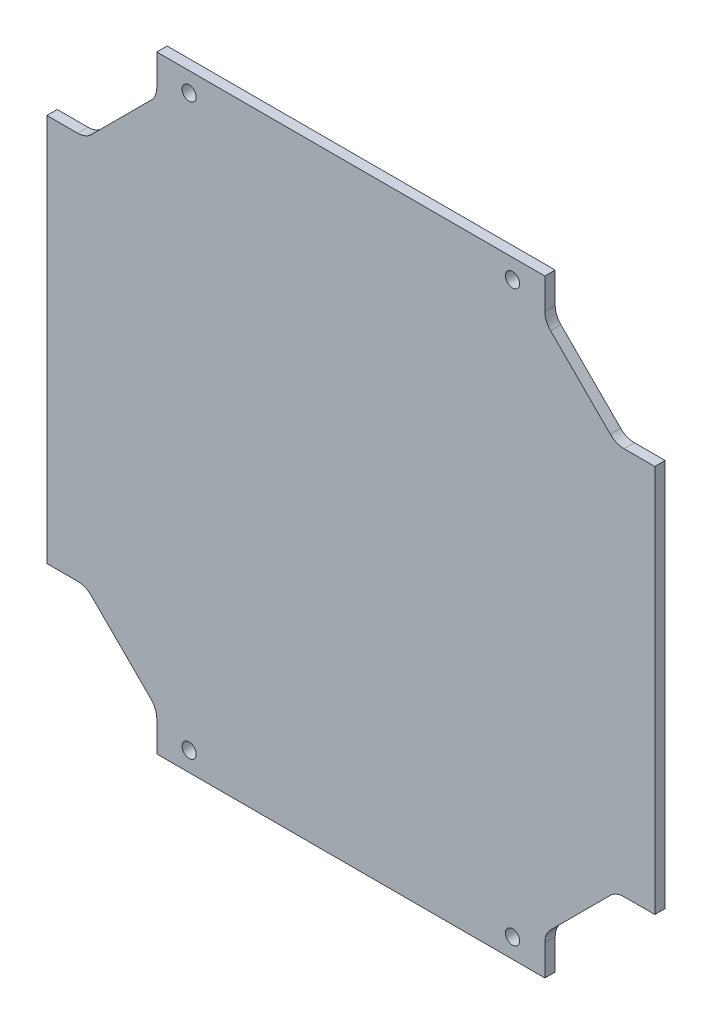
ISO-10303-21;
HEADER;
FILE_DESCRIPTION(('STEP AP214'),'2;1');
FILE_NAME('part.step','',(''),(''),'','','');
FILE_SCHEMA(('AUTOMOTIVE_DESIGN { 1 0 10303 214 1 1 1 1 }'));
ENDSEC;
DATA;
#1=APPLICATION_CONTEXT('core data for automotive mechanical design processes');
#2=APPLICATION_PROTOCOL_DEFINITION('international standard','automotive_design',2000,#1);
#3=PRODUCT_CONTEXT('',#1,'mechanical');
#4=PRODUCT('Part','Part','',(#3));
#5=PRODUCT_RELATED_PRODUCT_CATEGORY('part','',(#4));
#6=PRODUCT_DEFINITION_FORMATION('','',#4);
#7=PRODUCT_DEFINITION_CONTEXT('part definition',#1,'design');
#8=PRODUCT_DEFINITION('design','',#6,#7);
#9=PRODUCT_DEFINITION_SHAPE('','',#8);
#10=(LENGTH_UNIT() NAMED_UNIT(*) SI_UNIT(.MILLI.,.METRE.));
#11=(NAMED_UNIT(*) PLANE_ANGLE_UNIT() SI_UNIT($,.RADIAN.));
#12=(NAMED_UNIT(*) SI_UNIT($,.STERADIAN.) SOLID_ANGLE_UNIT());
#13=UNCERTAINTY_MEASURE_WITH_UNIT(LENGTH_MEASURE(1.E-05),#10,'distance_accuracy_value','');
#14=(GEOMETRIC_REPRESENTATION_CONTEXT(3) GLOBAL_UNCERTAINTY_ASSIGNED_CONTEXT((#13)) GLOBAL_UNIT_ASSIGNED_CONTEXT((#10,
#11,#12)) REPRESENTATION_CONTEXT('',''));
#15=CARTESIAN_POINT('',(0.,0.,0.));
#16=DIRECTION('',(0.,0.,1.));
#17=DIRECTION('',(1.,0.,0.));
#18=AXIS2_PLACEMENT_3D('',#15,#16,#17);
#19=CARTESIAN_POINT('',(-69.5653438799531,14.9518569300748,1.6));
#20=DIRECTION('',(0.,0.,-1.));
#21=DIRECTION('',(-1.,0.,0.));
#22=AXIS2_PLACEMENT_3D('',#19,#20,#21);
#23=PLANE('',#22);
#24=CARTESIAN_POINT('',(-14.5653438799531,88.9518569300749,1.6));
#25=DIRECTION('',(0.,0.,1.));
#26=DIRECTION('',(1.,0.,0.));
#27=AXIS2_PLACEMENT_3D('',#24,#25,#26);
#28=CIRCLE('',#27,1.1);
#29=CARTESIAN_POINT('',(-13.4653438799531,88.9518569300749,1.6));
#30=VERTEX_POINT('',#29);
#31=EDGE_CURVE('E730',#30,#30,#28,.T.);
#32=ORIENTED_EDGE('',*,*,#31,.F.);
#33=EDGE_LOOP('',(#32));
#34=FACE_BOUND('',#33,.T.);
#35=CARTESIAN_POINT('',(-64.5653438799532,88.9518569300749,1.6));
#36=DIRECTION('',(0.,0.,1.));
#37=DIRECTION('',(1.,0.,0.));
#38=AXIS2_PLACEMENT_3D('',#35,#36,#37);
#39=CIRCLE('',#38,1.10000000000001);
#40=CARTESIAN_POINT('',(-63.4653438799532,88.9518569300749,1.6));
#41=VERTEX_POINT('',#40);
#42=EDGE_CURVE('E257',#41,#41,#39,.T.);
#43=ORIENTED_EDGE('',*,*,#42,.F.);
#44=EDGE_LOOP('',(#43));
#45=FACE_BOUND('',#44,.T.);
#46=DIRECTION('',(1.,0.,0.));
#47=VECTOR('',#46,1.);
#48=CARTESIAN_POINT('',(-86.5653438799531,14.9518569300748,1.6));
#49=LINE('',#48,#47);
#50=CARTESIAN_POINT('',(-86.5653438799531,14.9518569300748,1.6));
#51=VERTEX_POINT('',#50);
#52=CARTESIAN_POINT('',(-81.8079845670724,14.9518569300748,1.6));
#53=VERTEX_POINT('',#52);
#54=EDGE_CURVE('E292',#51,#53,#49,.T.);
#55=ORIENTED_EDGE('',*,*,#54,.T.);
#56=CARTESIAN_POINT('',(-81.8079845670724,11.9518569300748,1.6));
#57=DIRECTION('',(0.,0.,-1.));
#58=DIRECTION('',(-1.,0.,0.));
#59=AXIS2_PLACEMENT_3D('',#56,#57,#58);
#60=CIRCLE('',#59,3.);
#61=CARTESIAN_POINT('',(-79.6866642235128,14.0731772736345,1.6));
#62=VERTEX_POINT('',#61);
#63=EDGE_CURVE('E350',#53,#62,#60,.T.);
#64=ORIENTED_EDGE('',*,*,#63,.T.);
#65=DIRECTION('',(0.707106781186547,-0.707106781186547,0.));
#66=VECTOR('',#65,1.);
#67=CARTESIAN_POINT('',(-80.5653438799531,14.9518569300748,1.6));
#68=LINE('',#67,#66);
#69=CARTESIAN_POINT('',(-70.4440235363935,4.83053658651517,1.6));
#70=VERTEX_POINT('',#69);
#71=EDGE_CURVE('E206',#62,#70,#68,.T.);
#72=ORIENTED_EDGE('',*,*,#71,.T.);
#73=CARTESIAN_POINT('',(-72.5653438799532,2.70921624295552,1.6));
#74=DIRECTION('',(0.,0.,-1.));
#75=DIRECTION('',(-1.,0.,0.));
#76=AXIS2_PLACEMENT_3D('',#73,#74,#75);
#77=CIRCLE('',#76,3.);
#78=CARTESIAN_POINT('',(-69.5653438799531,2.70921624295552,1.6));
#79=VERTEX_POINT('',#78);
#80=EDGE_CURVE('E202',#70,#79,#77,.T.);
#81=ORIENTED_EDGE('',*,*,#80,.T.);
#82=DIRECTION('',(0.,-1.,0.));
#83=VECTOR('',#82,1.);
#84=CARTESIAN_POINT('',(-69.5653438799531,3.95185693007481,1.6));
#85=LINE('',#84,#83);
#86=CARTESIAN_POINT('',(-69.5653438799531,-2.04814306992522,1.6));
#87=VERTEX_POINT('',#86);
#88=EDGE_CURVE('E192',#79,#87,#85,.T.);
#89=ORIENTED_EDGE('',*,*,#88,.T.);
#90=DIRECTION('',(1.,0.,0.));
#91=VECTOR('',#90,1.);
#92=CARTESIAN_POINT('',(-69.5653438799531,-2.04814306992522,1.6));
#93=LINE('',#92,#91);
#94=CARTESIAN_POINT('',(-9.56534387995308,-2.04814306992519,1.6));
#95=VERTEX_POINT('',#94);
#96=EDGE_CURVE('E198',#87,#95,#93,.T.);
#97=ORIENTED_EDGE('',*,*,#96,.T.);
#98=DIRECTION('',(0.,1.,0.));
#99=VECTOR('',#98,1.);
#100=CARTESIAN_POINT('',(-9.56534387995305,3.95185693007478,1.6));
#101=LINE('',#100,#99);
#102=CARTESIAN_POINT('',(-9.56534387995305,2.70921624295551,1.6));
#103=VERTEX_POINT('',#102);
#104=EDGE_CURVE('E221',#95,#103,#101,.T.);
#105=ORIENTED_EDGE('',*,*,#104,.T.);
#106=CARTESIAN_POINT('',(-6.56534387995305,2.70921624295549,1.6));
#107=DIRECTION('',(0.,0.,-1.));
#108=DIRECTION('',(-1.,0.,0.));
#109=AXIS2_PLACEMENT_3D('',#106,#107,#108);
#110=CIRCLE('',#109,3.);
#111=CARTESIAN_POINT('',(-8.68666422351271,4.83053658651513,1.6));
#112=VERTEX_POINT('',#111);
#113=EDGE_CURVE('E357',#103,#112,#110,.T.);
#114=ORIENTED_EDGE('',*,*,#113,.T.);
#115=DIRECTION('',(0.707106781186545,0.70710678118655,0.));
#116=VECTOR('',#115,1.);
#117=CARTESIAN_POINT('',(-9.56534387995305,3.95185693007478,1.6));
#118=LINE('',#117,#116);
#119=CARTESIAN_POINT('',(0.555976463606556,14.0731772736345,1.6));
#120=VERTEX_POINT('',#119);
#121=EDGE_CURVE('E223',#112,#120,#118,.T.);
#122=ORIENTED_EDGE('',*,*,#121,.T.);
#123=CARTESIAN_POINT('',(2.67729680716621,11.9518569300748,1.6));
#124=DIRECTION('',(0.,0.,-1.));
#125=DIRECTION('',(-1.,0.,0.));
#126=AXIS2_PLACEMENT_3D('',#123,#124,#125);
#127=CIRCLE('',#126,3.);
#128=CARTESIAN_POINT('',(2.67729680716621,14.9518569300748,1.6));
#129=VERTEX_POINT('',#128);
#130=EDGE_CURVE('E361',#120,#129,#127,.T.);
#131=ORIENTED_EDGE('',*,*,#130,.T.);
#132=DIRECTION('',(1.,0.,0.));
#133=VECTOR('',#132,1.);
#134=CARTESIAN_POINT('',(7.43465612004692,14.9518569300748,1.6));
#135=LINE('',#134,#133);
#136=CARTESIAN_POINT('',(7.43465612004692,14.9518569300748,1.6));
#137=VERTEX_POINT('',#136);
#138=EDGE_CURVE('E229',#129,#137,#135,.T.);
#139=ORIENTED_EDGE('',*,*,#138,.T.);
#140=DIRECTION('',(0.,1.,0.));
#141=VECTOR('',#140,1.);
#142=CARTESIAN_POINT('',(7.43465612004692,74.9518569300749,1.6));
#143=LINE('',#142,#141);
#144=CARTESIAN_POINT('',(7.43465612004692,74.9518569300749,1.6));
#145=VERTEX_POINT('',#144);
#146=EDGE_CURVE('E231',#137,#145,#143,.T.);
#147=ORIENTED_EDGE('',*,*,#146,.T.);
#148=DIRECTION('',(-1.,0.,0.));
#149=VECTOR('',#148,1.);
#150=CARTESIAN_POINT('',(1.43465612004691,74.9518569300749,1.6));
#151=LINE('',#150,#149);
#152=CARTESIAN_POINT('',(2.67729680716619,74.9518569300749,1.6));
#153=VERTEX_POINT('',#152);
#154=EDGE_CURVE('E233',#145,#153,#151,.T.);
#155=ORIENTED_EDGE('',*,*,#154,.T.);
#156=CARTESIAN_POINT('',(2.67729680716619,77.9518569300749,1.6));
#157=DIRECTION('',(0.,0.,-1.));
#158=DIRECTION('',(-1.,0.,0.));
#159=AXIS2_PLACEMENT_3D('',#156,#157,#158);
#160=CIRCLE('',#159,3.);
#161=CARTESIAN_POINT('',(0.555976463606544,75.8305365865153,1.6));
#162=VERTEX_POINT('',#161);
#163=EDGE_CURVE('E369',#153,#162,#160,.T.);
#164=ORIENTED_EDGE('',*,*,#163,.T.);
#165=DIRECTION('',(-0.707106781186547,0.707106781186548,0.));
#166=VECTOR('',#165,1.);
#167=CARTESIAN_POINT('',(-9.56534387995309,85.9518569300749,1.6));
#168=LINE('',#167,#166);
#169=CARTESIAN_POINT('',(-8.68666422351274,85.0731772736346,1.6));
#170=VERTEX_POINT('',#169);
#171=EDGE_CURVE('E236',#162,#170,#168,.T.);
#172=ORIENTED_EDGE('',*,*,#171,.T.);
#173=CARTESIAN_POINT('',(-6.56534387995309,87.1944976171942,1.6));
#174=DIRECTION('',(0.,0.,-1.));
#175=DIRECTION('',(-1.,0.,0.));
#176=AXIS2_PLACEMENT_3D('',#173,#174,#175);
#177=CIRCLE('',#176,3.);
#178=CARTESIAN_POINT('',(-9.56534387995309,87.1944976171942,1.6));
#179=VERTEX_POINT('',#178);
#180=EDGE_CURVE('E365',#170,#179,#177,.T.);
#181=ORIENTED_EDGE('',*,*,#180,.T.);
#182=DIRECTION('',(0.,1.,0.));
#183=VECTOR('',#182,1.);
#184=CARTESIAN_POINT('',(-9.56534387995309,91.9518569300749,1.6));
#185=LINE('',#184,#183);
#186=CARTESIAN_POINT('',(-9.56534387995309,91.9518569300749,1.6));
#187=VERTEX_POINT('',#186);
#188=EDGE_CURVE('E239',#179,#187,#185,.T.);
#189=ORIENTED_EDGE('',*,*,#188,.T.);
#190=DIRECTION('',(-1.,0.,0.));
#191=VECTOR('',#190,1.);
#192=CARTESIAN_POINT('',(-69.5653438799531,91.9518569300749,1.6));
#193=LINE('',#192,#191);
#194=CARTESIAN_POINT('',(-69.5653438799531,91.9518569300749,1.6));
#195=VERTEX_POINT('',#194);
#196=EDGE_CURVE('E241',#187,#195,#193,.T.);
#197=ORIENTED_EDGE('',*,*,#196,.T.);
#198=DIRECTION('',(0.,-1.,0.));
#199=VECTOR('',#198,1.);
#200=CARTESIAN_POINT('',(-69.5653438799531,85.9518569300749,1.6));
#201=LINE('',#200,#199);
#202=CARTESIAN_POINT('',(-69.5653438799531,87.1944976171942,1.6));
#203=VERTEX_POINT('',#202);
#204=EDGE_CURVE('E243',#195,#203,#201,.T.);
#205=ORIENTED_EDGE('',*,*,#204,.T.);
#206=CARTESIAN_POINT('',(-72.5653438799532,87.1944976171942,1.6));
#207=DIRECTION('',(0.,0.,-1.));
#208=DIRECTION('',(-1.,0.,0.));
#209=AXIS2_PLACEMENT_3D('',#206,#207,#208);
#210=CIRCLE('',#209,3.);
#211=CARTESIAN_POINT('',(-70.4440235363935,85.0731772736345,1.6));
#212=VERTEX_POINT('',#211);
#213=EDGE_CURVE('E11',#203,#212,#210,.T.);
#214=ORIENTED_EDGE('',*,*,#213,.T.);
#215=DIRECTION('',(-0.707106781186547,-0.707106781186547,0.));
#216=VECTOR('',#215,1.);
#217=CARTESIAN_POINT('',(-80.5653438799531,74.9518569300749,1.6));
#218=LINE('',#217,#216);
#219=CARTESIAN_POINT('',(-79.6866642235128,75.8305365865153,1.6));
#220=VERTEX_POINT('',#219);
#221=EDGE_CURVE('E245',#212,#220,#218,.T.);
#222=ORIENTED_EDGE('',*,*,#221,.T.);
#223=CARTESIAN_POINT('',(-81.8079845670724,77.9518569300749,1.6));
#224=DIRECTION('',(0.,0.,-1.));
#225=DIRECTION('',(-1.,0.,0.));
#226=AXIS2_PLACEMENT_3D('',#223,#224,#225);
#227=CIRCLE('',#226,3.);
#228=CARTESIAN_POINT('',(-81.8079845670724,74.9518569300749,1.6));
#229=VERTEX_POINT('',#228);
#230=EDGE_CURVE('E373',#220,#229,#227,.T.);
#231=ORIENTED_EDGE('',*,*,#230,.T.);
#232=DIRECTION('',(-1.,0.,0.));
#233=VECTOR('',#232,1.);
#234=CARTESIAN_POINT('',(-86.5653438799532,74.9518569300749,1.6));
#235=LINE('',#234,#233);
#236=CARTESIAN_POINT('',(-86.5653438799532,74.9518569300749,1.6));
#237=VERTEX_POINT('',#236);
#238=EDGE_CURVE('E248',#229,#237,#235,.T.);
#239=ORIENTED_EDGE('',*,*,#238,.T.);
#240=DIRECTION('',(0.,-1.,0.));
#241=VECTOR('',#240,1.);
#242=CARTESIAN_POINT('',(-86.5653438799532,74.9518569300749,1.6));
#243=LINE('',#242,#241);
#244=EDGE_CURVE('E250',#237,#51,#243,.T.);
#245=ORIENTED_EDGE('',*,*,#244,.T.);
#246=EDGE_LOOP('',(#55,#64,#72,#81,#89,#97,#105,#114,#122,#131,#139,#147,#155,#164,#172,#181,
#189,#197,#205,#214,#222,#231,#239,#245));
#247=FACE_BOUND('',#246,.T.);
#248=CARTESIAN_POINT('',(-64.5653438799531,0.951856930074832,1.6));
#249=DIRECTION('',(0.,0.,1.));
#250=DIRECTION('',(1.,0.,0.));
#251=AXIS2_PLACEMENT_3D('',#248,#249,#250);
#252=CIRCLE('',#251,1.10000000000001);
#253=CARTESIAN_POINT('',(-63.4653438799531,0.951856930074832,1.6));
#254=VERTEX_POINT('',#253);
#255=EDGE_CURVE('E724',#254,#254,#252,.T.);
#256=ORIENTED_EDGE('',*,*,#255,.F.);
#257=EDGE_LOOP('',(#256));
#258=FACE_BOUND('',#257,.T.);
#259=CARTESIAN_POINT('',(-14.5653438799531,0.951856930074832,1.6));
#260=DIRECTION('',(0.,0.,1.));
#261=DIRECTION('',(1.,0.,0.));
#262=AXIS2_PLACEMENT_3D('',#259,#260,#261);
#263=CIRCLE('',#262,1.1);
#264=CARTESIAN_POINT('',(-13.4653438799531,0.951856930074832,1.6));
#265=VERTEX_POINT('',#264);
#266=EDGE_CURVE('E736',#265,#265,#263,.T.);
#267=ORIENTED_EDGE('',*,*,#266,.F.);
#268=EDGE_LOOP('',(#267));
#269=FACE_BOUND('',#268,.T.);
#270=ADVANCED_FACE('F32',(#34,#45,#247,#258,#269),#23,.F.);
#271=CARTESIAN_POINT('',(-69.5653438799531,14.9518569300748,0.));
#272=DIRECTION('',(0.,0.,-1.));
#273=DIRECTION('',(-1.,0.,0.));
#274=AXIS2_PLACEMENT_3D('',#271,#272,#273);
#275=PLANE('',#274);
#276=CARTESIAN_POINT('',(-14.5653438799531,88.9518569300749,0.));
#277=DIRECTION('',(0.,0.,1.));
#278=DIRECTION('',(1.,0.,0.));
#279=AXIS2_PLACEMENT_3D('',#276,#277,#278);
#280=CIRCLE('',#279,1.1);
#281=CARTESIAN_POINT('',(-13.4653438799531,88.9518569300749,0.));
#282=VERTEX_POINT('',#281);
#283=EDGE_CURVE('E733',#282,#282,#280,.T.);
#284=ORIENTED_EDGE('',*,*,#283,.T.);
#285=EDGE_LOOP('',(#284));
#286=FACE_BOUND('',#285,.T.);
#287=CARTESIAN_POINT('',(-64.5653438799532,88.9518569300749,0.));
#288=DIRECTION('',(0.,0.,1.));
#289=DIRECTION('',(1.,0.,0.));
#290=AXIS2_PLACEMENT_3D('',#287,#288,#289);
#291=CIRCLE('',#290,1.10000000000001);
#292=CARTESIAN_POINT('',(-63.4653438799532,88.9518569300749,0.));
#293=VERTEX_POINT('',#292);
#294=EDGE_CURVE('E721',#293,#293,#291,.T.);
#295=ORIENTED_EDGE('',*,*,#294,.T.);
#296=EDGE_LOOP('',(#295));
#297=FACE_BOUND('',#296,.T.);
#298=DIRECTION('',(1.,0.,0.));
#299=VECTOR('',#298,1.);
#300=CARTESIAN_POINT('',(-86.5653438799531,14.9518569300748,0.));
#301=LINE('',#300,#299);
#302=CARTESIAN_POINT('',(-86.5653438799531,14.9518569300748,0.));
#303=VERTEX_POINT('',#302);
#304=CARTESIAN_POINT('',(-81.8079845670724,14.9518569300748,0.));
#305=VERTEX_POINT('',#304);
#306=EDGE_CURVE('E253',#303,#305,#301,.T.);
#307=ORIENTED_EDGE('',*,*,#306,.F.);
#308=DIRECTION('',(0.,-1.,0.));
#309=VECTOR('',#308,1.);
#310=CARTESIAN_POINT('',(-86.5653438799532,74.9518569300749,0.));
#311=LINE('',#310,#309);
#312=CARTESIAN_POINT('',(-86.5653438799532,74.9518569300749,0.));
#313=VERTEX_POINT('',#312);
#314=EDGE_CURVE('E290',#313,#303,#311,.T.);
#315=ORIENTED_EDGE('',*,*,#314,.F.);
#316=DIRECTION('',(-1.,0.,0.));
#317=VECTOR('',#316,1.);
#318=CARTESIAN_POINT('',(-86.5653438799532,74.9518569300749,0.));
#319=LINE('',#318,#317);
#320=CARTESIAN_POINT('',(-81.8079845670724,74.9518569300749,0.));
#321=VERTEX_POINT('',#320);
#322=EDGE_CURVE('E288',#321,#313,#319,.T.);
#323=ORIENTED_EDGE('',*,*,#322,.F.);
#324=CARTESIAN_POINT('',(-81.8079845670724,77.9518569300749,0.));
#325=DIRECTION('',(0.,0.,-1.));
#326=DIRECTION('',(-1.,0.,0.));
#327=AXIS2_PLACEMENT_3D('',#324,#325,#326);
#328=CIRCLE('',#327,3.);
#329=CARTESIAN_POINT('',(-79.6866642235128,75.8305365865153,0.));
#330=VERTEX_POINT('',#329);
#331=EDGE_CURVE('E371',#321,#330,#328,.F.);
#332=ORIENTED_EDGE('',*,*,#331,.T.);
#333=DIRECTION('',(-0.707106781186547,-0.707106781186547,0.));
#334=VECTOR('',#333,1.);
#335=CARTESIAN_POINT('',(-80.5653438799531,74.9518569300749,0.));
#336=LINE('',#335,#334);
#337=CARTESIAN_POINT('',(-70.4440235363935,85.0731772736345,0.));
#338=VERTEX_POINT('',#337);
#339=EDGE_CURVE('E285',#338,#330,#336,.T.);
#340=ORIENTED_EDGE('',*,*,#339,.F.);
#341=CARTESIAN_POINT('',(-72.5653438799532,87.1944976171942,0.));
#342=DIRECTION('',(0.,0.,-1.));
#343=DIRECTION('',(-1.,0.,0.));
#344=AXIS2_PLACEMENT_3D('',#341,#342,#343);
#345=CIRCLE('',#344,3.);
#346=CARTESIAN_POINT('',(-69.5653438799531,87.1944976171942,0.));
#347=VERTEX_POINT('',#346);
#348=EDGE_CURVE('E40',#338,#347,#345,.F.);
#349=ORIENTED_EDGE('',*,*,#348,.T.);
#350=DIRECTION('',(0.,-1.,0.));
#351=VECTOR('',#350,1.);
#352=CARTESIAN_POINT('',(-69.5653438799531,85.9518569300749,0.));
#353=LINE('',#352,#351);
#354=CARTESIAN_POINT('',(-69.5653438799531,91.9518569300749,0.));
#355=VERTEX_POINT('',#354);
#356=EDGE_CURVE('E283',#355,#347,#353,.T.);
#357=ORIENTED_EDGE('',*,*,#356,.F.);
#358=DIRECTION('',(-1.,0.,0.));
#359=VECTOR('',#358,1.);
#360=CARTESIAN_POINT('',(-69.5653438799531,91.9518569300749,0.));
#361=LINE('',#360,#359);
#362=CARTESIAN_POINT('',(-9.56534387995309,91.9518569300749,0.));
#363=VERTEX_POINT('',#362);
#364=EDGE_CURVE('E281',#363,#355,#361,.T.);
#365=ORIENTED_EDGE('',*,*,#364,.F.);
#366=DIRECTION('',(0.,1.,0.));
#367=VECTOR('',#366,1.);
#368=CARTESIAN_POINT('',(-9.56534387995309,91.9518569300749,0.));
#369=LINE('',#368,#367);
#370=CARTESIAN_POINT('',(-9.56534387995309,87.1944976171942,0.));
#371=VERTEX_POINT('',#370);
#372=EDGE_CURVE('E279',#371,#363,#369,.T.);
#373=ORIENTED_EDGE('',*,*,#372,.F.);
#374=CARTESIAN_POINT('',(-6.56534387995309,87.1944976171942,0.));
#375=DIRECTION('',(0.,0.,-1.));
#376=DIRECTION('',(-1.,0.,0.));
#377=AXIS2_PLACEMENT_3D('',#374,#375,#376);
#378=CIRCLE('',#377,3.);
#379=CARTESIAN_POINT('',(-8.68666422351274,85.0731772736346,0.));
#380=VERTEX_POINT('',#379);
#381=EDGE_CURVE('E363',#371,#380,#378,.F.);
#382=ORIENTED_EDGE('',*,*,#381,.T.);
#383=DIRECTION('',(-0.707106781186547,0.707106781186548,0.));
#384=VECTOR('',#383,1.);
#385=CARTESIAN_POINT('',(-9.56534387995309,85.9518569300749,0.));
#386=LINE('',#385,#384);
#387=CARTESIAN_POINT('',(0.555976463606544,75.8305365865153,0.));
#388=VERTEX_POINT('',#387);
#389=EDGE_CURVE('E276',#388,#380,#386,.T.);
#390=ORIENTED_EDGE('',*,*,#389,.F.);
#391=CARTESIAN_POINT('',(2.67729680716619,77.9518569300749,0.));
#392=DIRECTION('',(0.,0.,-1.));
#393=DIRECTION('',(-1.,0.,0.));
#394=AXIS2_PLACEMENT_3D('',#391,#392,#393);
#395=CIRCLE('',#394,3.);
#396=CARTESIAN_POINT('',(2.67729680716619,74.9518569300749,0.));
#397=VERTEX_POINT('',#396);
#398=EDGE_CURVE('E367',#388,#397,#395,.F.);
#399=ORIENTED_EDGE('',*,*,#398,.T.);
#400=DIRECTION('',(-1.,0.,0.));
#401=VECTOR('',#400,1.);
#402=CARTESIAN_POINT('',(1.43465612004691,74.9518569300749,0.));
#403=LINE('',#402,#401);
#404=CARTESIAN_POINT('',(7.43465612004692,74.9518569300749,0.));
#405=VERTEX_POINT('',#404);
#406=EDGE_CURVE('E273',#405,#397,#403,.T.);
#407=ORIENTED_EDGE('',*,*,#406,.F.);
#408=DIRECTION('',(0.,1.,0.));
#409=VECTOR('',#408,1.);
#410=CARTESIAN_POINT('',(7.43465612004692,74.9518569300749,0.));
#411=LINE('',#410,#409);
#412=CARTESIAN_POINT('',(7.43465612004692,14.9518569300748,0.));
#413=VERTEX_POINT('',#412);
#414=EDGE_CURVE('E271',#413,#405,#411,.T.);
#415=ORIENTED_EDGE('',*,*,#414,.F.);
#416=DIRECTION('',(1.,0.,0.));
#417=VECTOR('',#416,1.);
#418=CARTESIAN_POINT('',(7.43465612004692,14.9518569300748,0.));
#419=LINE('',#418,#417);
#420=CARTESIAN_POINT('',(2.67729680716621,14.9518569300748,0.));
#421=VERTEX_POINT('',#420);
#422=EDGE_CURVE('E269',#421,#413,#419,.T.);
#423=ORIENTED_EDGE('',*,*,#422,.F.);
#424=CARTESIAN_POINT('',(2.67729680716621,11.9518569300748,0.));
#425=DIRECTION('',(0.,0.,-1.));
#426=DIRECTION('',(-1.,0.,0.));
#427=AXIS2_PLACEMENT_3D('',#424,#425,#426);
#428=CIRCLE('',#427,3.);
#429=CARTESIAN_POINT('',(0.555976463606556,14.0731772736345,0.));
#430=VERTEX_POINT('',#429);
#431=EDGE_CURVE('E359',#421,#430,#428,.F.);
#432=ORIENTED_EDGE('',*,*,#431,.T.);
#433=DIRECTION('',(0.707106781186545,0.70710678118655,0.));
#434=VECTOR('',#433,1.);
#435=CARTESIAN_POINT('',(-9.56534387995305,3.95185693007478,0.));
#436=LINE('',#435,#434);
#437=CARTESIAN_POINT('',(-8.68666422351271,4.83053658651513,0.));
#438=VERTEX_POINT('',#437);
#439=EDGE_CURVE('E266',#438,#430,#436,.T.);
#440=ORIENTED_EDGE('',*,*,#439,.F.);
#441=CARTESIAN_POINT('',(-6.56534387995305,2.70921624295549,0.));
#442=DIRECTION('',(0.,0.,-1.));
#443=DIRECTION('',(-1.,0.,0.));
#444=AXIS2_PLACEMENT_3D('',#441,#442,#443);
#445=CIRCLE('',#444,3.);
#446=CARTESIAN_POINT('',(-9.56534387995305,2.70921624295551,0.));
#447=VERTEX_POINT('',#446);
#448=EDGE_CURVE('E355',#438,#447,#445,.F.);
#449=ORIENTED_EDGE('',*,*,#448,.T.);
#450=DIRECTION('',(0.,1.,0.));
#451=VECTOR('',#450,1.);
#452=CARTESIAN_POINT('',(-9.56534387995305,3.95185693007478,0.));
#453=LINE('',#452,#451);
#454=CARTESIAN_POINT('',(-9.56534387995308,-2.04814306992519,0.));
#455=VERTEX_POINT('',#454);
#456=EDGE_CURVE('E263',#455,#447,#453,.T.);
#457=ORIENTED_EDGE('',*,*,#456,.F.);
#458=DIRECTION('',(1.,0.,0.));
#459=VECTOR('',#458,1.);
#460=CARTESIAN_POINT('',(-69.5653438799531,-2.04814306992522,0.));
#461=LINE('',#460,#459);
#462=CARTESIAN_POINT('',(-69.5653438799531,-2.04814306992522,0.));
#463=VERTEX_POINT('',#462);
#464=EDGE_CURVE('E261',#463,#455,#461,.T.);
#465=ORIENTED_EDGE('',*,*,#464,.F.);
#466=DIRECTION('',(0.,-1.,0.));
#467=VECTOR('',#466,1.);
#468=CARTESIAN_POINT('',(-69.5653438799531,3.95185693007481,0.));
#469=LINE('',#468,#467);
#470=CARTESIAN_POINT('',(-69.5653438799531,2.70921624295552,0.));
#471=VERTEX_POINT('',#470);
#472=EDGE_CURVE('E212',#471,#463,#469,.T.);
#473=ORIENTED_EDGE('',*,*,#472,.F.);
#474=CARTESIAN_POINT('',(-72.5653438799532,2.70921624295552,0.));
#475=DIRECTION('',(0.,0.,-1.));
#476=DIRECTION('',(-1.,0.,0.));
#477=AXIS2_PLACEMENT_3D('',#474,#475,#476);
#478=CIRCLE('',#477,3.);
#479=CARTESIAN_POINT('',(-70.4440235363935,4.83053658651517,0.));
#480=VERTEX_POINT('',#479);
#481=EDGE_CURVE('E352',#471,#480,#478,.F.);
#482=ORIENTED_EDGE('',*,*,#481,.T.);
#483=DIRECTION('',(0.707106781186547,-0.707106781186547,0.));
#484=VECTOR('',#483,1.);
#485=CARTESIAN_POINT('',(-80.5653438799531,14.9518569300748,0.));
#486=LINE('',#485,#484);
#487=CARTESIAN_POINT('',(-79.6866642235128,14.0731772736345,0.));
#488=VERTEX_POINT('',#487);
#489=EDGE_CURVE('E256',#488,#480,#486,.T.);
#490=ORIENTED_EDGE('',*,*,#489,.F.);
#491=CARTESIAN_POINT('',(-81.8079845670724,11.9518569300748,0.));
#492=DIRECTION('',(0.,0.,-1.));
#493=DIRECTION('',(-1.,0.,0.));
#494=AXIS2_PLACEMENT_3D('',#491,#492,#493);
#495=CIRCLE('',#494,3.);
#496=EDGE_CURVE('E348',#488,#305,#495,.F.);
#497=ORIENTED_EDGE('',*,*,#496,.T.);
#498=EDGE_LOOP('',(#307,#315,#323,#332,#340,#349,#357,#365,#373,#382,#390,#399,#407,#415,#423,
#432,#440,#449,#457,#465,#473,#482,#490,#497));
#499=FACE_BOUND('',#498,.T.);
#500=CARTESIAN_POINT('',(-64.5653438799531,0.951856930074832,0.));
#501=DIRECTION('',(0.,0.,1.));
#502=DIRECTION('',(1.,0.,0.));
#503=AXIS2_PLACEMENT_3D('',#500,#501,#502);
#504=CIRCLE('',#503,1.10000000000001);
#505=CARTESIAN_POINT('',(-63.4653438799531,0.951856930074832,0.));
#506=VERTEX_POINT('',#505);
#507=EDGE_CURVE('E727',#506,#506,#504,.T.);
#508=ORIENTED_EDGE('',*,*,#507,.T.);
#509=EDGE_LOOP('',(#508));
#510=FACE_BOUND('',#509,.T.);
#511=CARTESIAN_POINT('',(-14.5653438799531,0.951856930074832,0.));
#512=DIRECTION('',(0.,0.,1.));
#513=DIRECTION('',(1.,0.,0.));
#514=AXIS2_PLACEMENT_3D('',#511,#512,#513);
#515=CIRCLE('',#514,1.1);
#516=CARTESIAN_POINT('',(-13.4653438799531,0.951856930074832,0.));
#517=VERTEX_POINT('',#516);
#518=EDGE_CURVE('E739',#517,#517,#515,.T.);
#519=ORIENTED_EDGE('',*,*,#518,.T.);
#520=EDGE_LOOP('',(#519));
#521=FACE_BOUND('',#520,.T.);
#522=ADVANCED_FACE('F387',(#286,#297,#499,#510,#521),#275,.T.);
#523=CARTESIAN_POINT('',(-86.5653438799531,14.9518569300748,1.6));
#524=DIRECTION('',(0.,1.,0.));
#525=DIRECTION('',(0.,0.,1.));
#526=AXIS2_PLACEMENT_3D('',#523,#524,#525);
#527=PLANE('',#526);
#528=ORIENTED_EDGE('',*,*,#306,.T.);
#529=DIRECTION('',(0.,0.,-1.));
#530=VECTOR('',#529,1.);
#531=CARTESIAN_POINT('',(-81.8079845670724,14.9518569300748,1.6));
#532=LINE('',#531,#530);
#533=EDGE_CURVE('E315',#305,#53,#532,.F.);
#534=ORIENTED_EDGE('',*,*,#533,.T.);
#535=ORIENTED_EDGE('',*,*,#54,.F.);
#536=DIRECTION('',(0.,0.,-1.));
#537=VECTOR('',#536,1.);
#538=CARTESIAN_POINT('',(-86.5653438799531,14.9518569300748,1.6));
#539=LINE('',#538,#537);
#540=EDGE_CURVE('E252',#51,#303,#539,.T.);
#541=ORIENTED_EDGE('',*,*,#540,.T.);
#542=EDGE_LOOP('',(#528,#534,#535,#541));
#543=FACE_BOUND('',#542,.T.);
#544=ADVANCED_FACE('F465',(#543),#527,.F.);
#545=CARTESIAN_POINT('',(-80.5653438799531,14.9518569300748,1.6));
#546=DIRECTION('',(0.707106781186548,0.707106781186548,0.));
#547=DIRECTION('',(-0.707106781186548,0.707106781186548,0.));
#548=AXIS2_PLACEMENT_3D('',#545,#546,#547);
#549=PLANE('',#548);
#550=ORIENTED_EDGE('',*,*,#71,.F.);
#551=DIRECTION('',(0.,0.,-1.));
#552=VECTOR('',#551,1.);
#553=CARTESIAN_POINT('',(-79.6866642235128,14.0731772736345,0.));
#554=LINE('',#553,#552);
#555=EDGE_CURVE('E312',#62,#488,#554,.T.);
#556=ORIENTED_EDGE('',*,*,#555,.T.);
#557=ORIENTED_EDGE('',*,*,#489,.T.);
#558=DIRECTION('',(0.,0.,-1.));
#559=VECTOR('',#558,1.);
#560=CARTESIAN_POINT('',(-70.4440235363935,4.83053658651517,1.6));
#561=LINE('',#560,#559);
#562=EDGE_CURVE('E215',#480,#70,#561,.F.);
#563=ORIENTED_EDGE('',*,*,#562,.T.);
#564=EDGE_LOOP('',(#550,#556,#557,#563));
#565=FACE_BOUND('',#564,.T.);
#566=ADVANCED_FACE('F679',(#565),#549,.F.);
#567=CARTESIAN_POINT('',(-69.5653438799531,3.95185693007481,1.6));
#568=DIRECTION('',(1.,0.,0.));
#569=DIRECTION('',(0.,0.,-1.));
#570=AXIS2_PLACEMENT_3D('',#567,#568,#569);
#571=PLANE('',#570);
#572=ORIENTED_EDGE('',*,*,#88,.F.);
#573=DIRECTION('',(0.,0.,-1.));
#574=VECTOR('',#573,1.);
#575=CARTESIAN_POINT('',(-69.5653438799531,2.70921624295552,0.));
#576=LINE('',#575,#574);
#577=EDGE_CURVE('E317',#79,#471,#576,.T.);
#578=ORIENTED_EDGE('',*,*,#577,.T.);
#579=ORIENTED_EDGE('',*,*,#472,.T.);
#580=DIRECTION('',(0.,0.,-1.));
#581=VECTOR('',#580,1.);
#582=CARTESIAN_POINT('',(-69.5653438799531,-2.04814306992522,1.6));
#583=LINE('',#582,#581);
#584=EDGE_CURVE('E209',#87,#463,#583,.T.);
#585=ORIENTED_EDGE('',*,*,#584,.F.);
#586=EDGE_LOOP('',(#572,#578,#579,#585));
#587=FACE_BOUND('',#586,.T.);
#588=ADVANCED_FACE('F210',(#587),#571,.F.);
#589=CARTESIAN_POINT('',(-69.5653438799531,-2.04814306992522,1.6));
#590=DIRECTION('',(0.,1.,0.));
#591=DIRECTION('',(-1.,0.,0.));
#592=AXIS2_PLACEMENT_3D('',#589,#590,#591);
#593=PLANE('',#592);
#594=ORIENTED_EDGE('',*,*,#464,.T.);
#595=DIRECTION('',(0.,0.,-1.));
#596=VECTOR('',#595,1.);
#597=CARTESIAN_POINT('',(-9.56534387995308,-2.04814306992519,1.6));
#598=LINE('',#597,#596);
#599=EDGE_CURVE('E216',#95,#455,#598,.T.);
#600=ORIENTED_EDGE('',*,*,#599,.F.);
#601=ORIENTED_EDGE('',*,*,#96,.F.);
#602=ORIENTED_EDGE('',*,*,#584,.T.);
#603=EDGE_LOOP('',(#594,#600,#601,#602));
#604=FACE_BOUND('',#603,.T.);
#605=ADVANCED_FACE('F218',(#604),#593,.F.);
#606=CARTESIAN_POINT('',(-9.56534387995305,3.95185693007478,1.6));
#607=DIRECTION('',(-1.,0.,0.));
#608=DIRECTION('',(0.,-1.,0.));
#609=AXIS2_PLACEMENT_3D('',#606,#607,#608);
#610=PLANE('',#609);
#611=ORIENTED_EDGE('',*,*,#456,.T.);
#612=DIRECTION('',(0.,0.,-1.));
#613=VECTOR('',#612,1.);
#614=CARTESIAN_POINT('',(-9.56534387995305,2.70921624295551,1.6));
#615=LINE('',#614,#613);
#616=EDGE_CURVE('E324',#447,#103,#615,.F.);
#617=ORIENTED_EDGE('',*,*,#616,.T.);
#618=ORIENTED_EDGE('',*,*,#104,.F.);
#619=ORIENTED_EDGE('',*,*,#599,.T.);
#620=EDGE_LOOP('',(#611,#617,#618,#619));
#621=FACE_BOUND('',#620,.T.);
#622=ADVANCED_FACE('F450',(#621),#610,.F.);
#623=CARTESIAN_POINT('',(-9.56534387995305,3.95185693007478,1.6));
#624=DIRECTION('',(-0.70710678118655,0.707106781186545,0.));
#625=DIRECTION('',(-0.707106781186545,-0.70710678118655,0.));
#626=AXIS2_PLACEMENT_3D('',#623,#624,#625);
#627=PLANE('',#626);
#628=ORIENTED_EDGE('',*,*,#121,.F.);
#629=DIRECTION('',(0.,0.,-1.));
#630=VECTOR('',#629,1.);
#631=CARTESIAN_POINT('',(-8.68666422351271,4.83053658651513,0.));
#632=LINE('',#631,#630);
#633=EDGE_CURVE('E321',#112,#438,#632,.T.);
#634=ORIENTED_EDGE('',*,*,#633,.T.);
#635=ORIENTED_EDGE('',*,*,#439,.T.);
#636=DIRECTION('',(0.,0.,-1.));
#637=VECTOR('',#636,1.);
#638=CARTESIAN_POINT('',(0.555976463606559,14.0731772736345,1.6));
#639=LINE('',#638,#637);
#640=EDGE_CURVE('E319',#430,#120,#639,.F.);
#641=ORIENTED_EDGE('',*,*,#640,.T.);
#642=EDGE_LOOP('',(#628,#634,#635,#641));
#643=FACE_BOUND('',#642,.T.);
#644=ADVANCED_FACE('F442',(#643),#627,.F.);
#645=CARTESIAN_POINT('',(7.43465612004692,14.9518569300748,1.6));
#646=DIRECTION('',(0.,1.,0.));
#647=DIRECTION('',(0.,0.,1.));
#648=AXIS2_PLACEMENT_3D('',#645,#646,#647);
#649=PLANE('',#648);
#650=ORIENTED_EDGE('',*,*,#138,.F.);
#651=DIRECTION('',(0.,0.,-1.));
#652=VECTOR('',#651,1.);
#653=CARTESIAN_POINT('',(2.67729680716621,14.9518569300748,0.));
#654=LINE('',#653,#652);
#655=EDGE_CURVE('E326',#129,#421,#654,.T.);
#656=ORIENTED_EDGE('',*,*,#655,.T.);
#657=ORIENTED_EDGE('',*,*,#422,.T.);
#658=DIRECTION('',(0.,0.,-1.));
#659=VECTOR('',#658,1.);
#660=CARTESIAN_POINT('',(7.43465612004692,14.9518569300748,1.6));
#661=LINE('',#660,#659);
#662=EDGE_CURVE('E307',#137,#413,#661,.T.);
#663=ORIENTED_EDGE('',*,*,#662,.F.);
#664=EDGE_LOOP('',(#650,#656,#657,#663));
#665=FACE_BOUND('',#664,.T.);
#666=ADVANCED_FACE('F434',(#665),#649,.F.);
#667=CARTESIAN_POINT('',(7.43465612004692,74.9518569300749,1.6));
#668=DIRECTION('',(-1.,0.,0.));
#669=DIRECTION('',(0.,-1.,0.));
#670=AXIS2_PLACEMENT_3D('',#667,#668,#669);
#671=PLANE('',#670);
#672=ORIENTED_EDGE('',*,*,#414,.T.);
#673=DIRECTION('',(0.,0.,-1.));
#674=VECTOR('',#673,1.);
#675=CARTESIAN_POINT('',(7.43465612004692,74.9518569300749,1.6));
#676=LINE('',#675,#674);
#677=EDGE_CURVE('E304',#145,#405,#676,.T.);
#678=ORIENTED_EDGE('',*,*,#677,.F.);
#679=ORIENTED_EDGE('',*,*,#146,.F.);
#680=ORIENTED_EDGE('',*,*,#662,.T.);
#681=EDGE_LOOP('',(#672,#678,#679,#680));
#682=FACE_BOUND('',#681,.T.);
#683=ADVANCED_FACE('F428',(#682),#671,.F.);
#684=CARTESIAN_POINT('',(1.43465612004691,74.9518569300749,1.6));
#685=DIRECTION('',(0.,-1.,0.));
#686=DIRECTION('',(0.,0.,-1.));
#687=AXIS2_PLACEMENT_3D('',#684,#685,#686);
#688=PLANE('',#687);
#689=ORIENTED_EDGE('',*,*,#406,.T.);
#690=DIRECTION('',(0.,0.,-1.));
#691=VECTOR('',#690,1.);
#692=CARTESIAN_POINT('',(2.67729680716619,74.9518569300749,1.6));
#693=LINE('',#692,#691);
#694=EDGE_CURVE('E337',#397,#153,#693,.F.);
#695=ORIENTED_EDGE('',*,*,#694,.T.);
#696=ORIENTED_EDGE('',*,*,#154,.F.);
#697=ORIENTED_EDGE('',*,*,#677,.T.);
#698=EDGE_LOOP('',(#689,#695,#696,#697));
#699=FACE_BOUND('',#698,.T.);
#700=ADVANCED_FACE('F423',(#699),#688,.F.);
#701=CARTESIAN_POINT('',(-9.56534387995309,85.9518569300749,1.6));
#702=DIRECTION('',(-0.707106781186548,-0.707106781186547,0.));
#703=DIRECTION('',(0.707106781186547,-0.707106781186548,0.));
#704=AXIS2_PLACEMENT_3D('',#701,#702,#703);
#705=PLANE('',#704);
#706=ORIENTED_EDGE('',*,*,#389,.T.);
#707=DIRECTION('',(0.,0.,-1.));
#708=VECTOR('',#707,1.);
#709=CARTESIAN_POINT('',(-8.68666422351273,85.0731772736346,1.6));
#710=LINE('',#709,#708);
#711=EDGE_CURVE('E335',#380,#170,#710,.F.);
#712=ORIENTED_EDGE('',*,*,#711,.T.);
#713=ORIENTED_EDGE('',*,*,#171,.F.);
#714=DIRECTION('',(0.,0.,-1.));
#715=VECTOR('',#714,1.);
#716=CARTESIAN_POINT('',(0.555976463606545,75.8305365865153,0.));
#717=LINE('',#716,#715);
#718=EDGE_CURVE('E332',#162,#388,#717,.T.);
#719=ORIENTED_EDGE('',*,*,#718,.T.);
#720=EDGE_LOOP('',(#706,#712,#713,#719));
#721=FACE_BOUND('',#720,.T.);
#722=ADVANCED_FACE('F413',(#721),#705,.F.);
#723=CARTESIAN_POINT('',(-9.56534387995309,91.9518569300749,1.6));
#724=DIRECTION('',(-1.,0.,0.));
#725=DIRECTION('',(0.,-1.,0.));
#726=AXIS2_PLACEMENT_3D('',#723,#724,#725);
#727=PLANE('',#726);
#728=ORIENTED_EDGE('',*,*,#188,.F.);
#729=DIRECTION('',(0.,0.,-1.));
#730=VECTOR('',#729,1.);
#731=CARTESIAN_POINT('',(-9.56534387995309,87.1944976171942,0.));
#732=LINE('',#731,#730);
#733=EDGE_CURVE('E329',#179,#371,#732,.T.);
#734=ORIENTED_EDGE('',*,*,#733,.T.);
#735=ORIENTED_EDGE('',*,*,#372,.T.);
#736=DIRECTION('',(0.,0.,-1.));
#737=VECTOR('',#736,1.);
#738=CARTESIAN_POINT('',(-9.56534387995309,91.9518569300749,1.6));
#739=LINE('',#738,#737);
#740=EDGE_CURVE('E301',#187,#363,#739,.T.);
#741=ORIENTED_EDGE('',*,*,#740,.F.);
#742=EDGE_LOOP('',(#728,#734,#735,#741));
#743=FACE_BOUND('',#742,.T.);
#744=ADVANCED_FACE('F405',(#743),#727,.F.);
#745=CARTESIAN_POINT('',(-69.5653438799531,91.9518569300749,1.6));
#746=DIRECTION('',(0.,-1.,0.));
#747=DIRECTION('',(1.,0.,0.));
#748=AXIS2_PLACEMENT_3D('',#745,#746,#747);
#749=PLANE('',#748);
#750=ORIENTED_EDGE('',*,*,#364,.T.);
#751=DIRECTION('',(0.,0.,-1.));
#752=VECTOR('',#751,1.);
#753=CARTESIAN_POINT('',(-69.5653438799531,91.9518569300749,1.6));
#754=LINE('',#753,#752);
#755=EDGE_CURVE('E298',#195,#355,#754,.T.);
#756=ORIENTED_EDGE('',*,*,#755,.F.);
#757=ORIENTED_EDGE('',*,*,#196,.F.);
#758=ORIENTED_EDGE('',*,*,#740,.T.);
#759=EDGE_LOOP('',(#750,#756,#757,#758));
#760=FACE_BOUND('',#759,.T.);
#761=ADVANCED_FACE('F401',(#760),#749,.F.);
#762=CARTESIAN_POINT('',(-69.5653438799531,85.9518569300749,1.6));
#763=DIRECTION('',(1.,0.,0.));
#764=DIRECTION('',(0.,0.,-1.));
#765=AXIS2_PLACEMENT_3D('',#762,#763,#764);
#766=PLANE('',#765);
#767=ORIENTED_EDGE('',*,*,#356,.T.);
#768=DIRECTION('',(0.,0.,-1.));
#769=VECTOR('',#768,1.);
#770=CARTESIAN_POINT('',(-69.5653438799531,87.1944976171942,1.6));
#771=LINE('',#770,#769);
#772=EDGE_CURVE('E47',#347,#203,#771,.F.);
#773=ORIENTED_EDGE('',*,*,#772,.T.);
#774=ORIENTED_EDGE('',*,*,#204,.F.);
#775=ORIENTED_EDGE('',*,*,#755,.T.);
#776=EDGE_LOOP('',(#767,#773,#774,#775));
#777=FACE_BOUND('',#776,.T.);
#778=ADVANCED_FACE('F397',(#777),#766,.F.);
#779=CARTESIAN_POINT('',(-80.5653438799531,74.9518569300749,1.6));
#780=DIRECTION('',(0.707106781186548,-0.707106781186548,0.));
#781=DIRECTION('',(0.707106781186548,0.707106781186548,0.));
#782=AXIS2_PLACEMENT_3D('',#779,#780,#781);
#783=PLANE('',#782);
#784=ORIENTED_EDGE('',*,*,#339,.T.);
#785=DIRECTION('',(0.,0.,-1.));
#786=VECTOR('',#785,1.);
#787=CARTESIAN_POINT('',(-79.6866642235128,75.8305365865153,1.6));
#788=LINE('',#787,#786);
#789=EDGE_CURVE('E345',#330,#220,#788,.F.);
#790=ORIENTED_EDGE('',*,*,#789,.T.);
#791=ORIENTED_EDGE('',*,*,#221,.F.);
#792=DIRECTION('',(0.,0.,-1.));
#793=VECTOR('',#792,1.);
#794=CARTESIAN_POINT('',(-70.4440235363935,85.0731772736345,0.));
#795=LINE('',#794,#793);
#796=EDGE_CURVE('E342',#212,#338,#795,.T.);
#797=ORIENTED_EDGE('',*,*,#796,.T.);
#798=EDGE_LOOP('',(#784,#790,#791,#797));
#799=FACE_BOUND('',#798,.T.);
#800=ADVANCED_FACE('F391',(#799),#783,.F.);
#801=CARTESIAN_POINT('',(-86.5653438799532,74.9518569300749,1.6));
#802=DIRECTION('',(0.,-1.,0.));
#803=DIRECTION('',(0.,0.,-1.));
#804=AXIS2_PLACEMENT_3D('',#801,#802,#803);
#805=PLANE('',#804);
#806=ORIENTED_EDGE('',*,*,#238,.F.);
#807=DIRECTION('',(0.,0.,-1.));
#808=VECTOR('',#807,1.);
#809=CARTESIAN_POINT('',(-81.8079845670724,74.9518569300749,0.));
#810=LINE('',#809,#808);
#811=EDGE_CURVE('E339',#229,#321,#810,.T.);
#812=ORIENTED_EDGE('',*,*,#811,.T.);
#813=ORIENTED_EDGE('',*,*,#322,.T.);
#814=DIRECTION('',(0.,0.,-1.));
#815=VECTOR('',#814,1.);
#816=CARTESIAN_POINT('',(-86.5653438799532,74.9518569300749,1.6));
#817=LINE('',#816,#815);
#818=EDGE_CURVE('E295',#237,#313,#817,.T.);
#819=ORIENTED_EDGE('',*,*,#818,.F.);
#820=EDGE_LOOP('',(#806,#812,#813,#819));
#821=FACE_BOUND('',#820,.T.);
#822=ADVANCED_FACE('F382',(#821),#805,.F.);
#823=CARTESIAN_POINT('',(-86.5653438799532,74.9518569300749,1.6));
#824=DIRECTION('',(1.,0.,0.));
#825=DIRECTION('',(0.,1.,0.));
#826=AXIS2_PLACEMENT_3D('',#823,#824,#825);
#827=PLANE('',#826);
#828=ORIENTED_EDGE('',*,*,#314,.T.);
#829=ORIENTED_EDGE('',*,*,#540,.F.);
#830=ORIENTED_EDGE('',*,*,#244,.F.);
#831=ORIENTED_EDGE('',*,*,#818,.T.);
#832=EDGE_LOOP('',(#828,#829,#830,#831));
#833=FACE_BOUND('',#832,.T.);
#834=ADVANCED_FACE('F474',(#833),#827,.F.);
#835=CARTESIAN_POINT('',(-64.5653438799532,88.9518569300749,1.6));
#836=DIRECTION('',(0.,0.,-1.));
#837=DIRECTION('',(-1.,0.,0.));
#838=AXIS2_PLACEMENT_3D('',#835,#836,#837);
#839=CYLINDRICAL_SURFACE('',#838,1.10000000000001);
#840=ORIENTED_EDGE('',*,*,#42,.T.);
#841=EDGE_LOOP('',(#840));
#842=FACE_BOUND('',#841,.T.);
#843=ORIENTED_EDGE('',*,*,#294,.F.);
#844=EDGE_LOOP('',(#843));
#845=FACE_BOUND('',#844,.T.);
#846=ADVANCED_FACE('F471',(#842,#845),#839,.F.);
#847=CARTESIAN_POINT('',(-64.5653438799531,0.951856930074832,1.6));
#848=DIRECTION('',(0.,0.,-1.));
#849=DIRECTION('',(-1.,0.,0.));
#850=AXIS2_PLACEMENT_3D('',#847,#848,#849);
#851=CYLINDRICAL_SURFACE('',#850,1.10000000000001);
#852=ORIENTED_EDGE('',*,*,#255,.T.);
#853=EDGE_LOOP('',(#852));
#854=FACE_BOUND('',#853,.T.);
#855=ORIENTED_EDGE('',*,*,#507,.F.);
#856=EDGE_LOOP('',(#855));
#857=FACE_BOUND('',#856,.T.);
#858=ADVANCED_FACE('F543',(#854,#857),#851,.F.);
#859=CARTESIAN_POINT('',(-14.5653438799531,88.9518569300749,1.6));
#860=DIRECTION('',(0.,0.,-1.));
#861=DIRECTION('',(-1.,0.,0.));
#862=AXIS2_PLACEMENT_3D('',#859,#860,#861);
#863=CYLINDRICAL_SURFACE('',#862,1.1);
#864=ORIENTED_EDGE('',*,*,#31,.T.);
#865=EDGE_LOOP('',(#864));
#866=FACE_BOUND('',#865,.T.);
#867=ORIENTED_EDGE('',*,*,#283,.F.);
#868=EDGE_LOOP('',(#867));
#869=FACE_BOUND('',#868,.T.);
#870=ADVANCED_FACE('F550',(#866,#869),#863,.F.);
#871=CARTESIAN_POINT('',(-14.5653438799531,0.951856930074832,1.6));
#872=DIRECTION('',(0.,0.,-1.));
#873=DIRECTION('',(-1.,0.,0.));
#874=AXIS2_PLACEMENT_3D('',#871,#872,#873);
#875=CYLINDRICAL_SURFACE('',#874,1.1);
#876=ORIENTED_EDGE('',*,*,#266,.T.);
#877=EDGE_LOOP('',(#876));
#878=FACE_BOUND('',#877,.T.);
#879=ORIENTED_EDGE('',*,*,#518,.F.);
#880=EDGE_LOOP('',(#879));
#881=FACE_BOUND('',#880,.T.);
#882=ADVANCED_FACE('F557',(#878,#881),#875,.F.);
#883=CARTESIAN_POINT('',(-81.8079845670724,11.9518569300748,1.6));
#884=DIRECTION('',(0.,0.,1.));
#885=DIRECTION('',(1.,0.,0.));
#886=AXIS2_PLACEMENT_3D('',#883,#884,#885);
#887=CYLINDRICAL_SURFACE('',#886,3.);
#888=ORIENTED_EDGE('',*,*,#63,.F.);
#889=ORIENTED_EDGE('',*,*,#533,.F.);
#890=ORIENTED_EDGE('',*,*,#496,.F.);
#891=ORIENTED_EDGE('',*,*,#555,.F.);
#892=EDGE_LOOP('',(#888,#889,#890,#891));
#893=FACE_BOUND('',#892,.T.);
#894=ADVANCED_FACE('F565',(#893),#887,.F.);
#895=CARTESIAN_POINT('',(-72.5653438799532,2.70921624295552,1.6));
#896=DIRECTION('',(0.,0.,1.));
#897=DIRECTION('',(1.,0.,0.));
#898=AXIS2_PLACEMENT_3D('',#895,#896,#897);
#899=CYLINDRICAL_SURFACE('',#898,3.);
#900=ORIENTED_EDGE('',*,*,#80,.F.);
#901=ORIENTED_EDGE('',*,*,#562,.F.);
#902=ORIENTED_EDGE('',*,*,#481,.F.);
#903=ORIENTED_EDGE('',*,*,#577,.F.);
#904=EDGE_LOOP('',(#900,#901,#902,#903));
#905=FACE_BOUND('',#904,.T.);
#906=ADVANCED_FACE('F572',(#905),#899,.F.);
#907=CARTESIAN_POINT('',(-6.56534387995305,2.70921624295549,1.6));
#908=DIRECTION('',(0.,0.,1.));
#909=DIRECTION('',(1.,0.,0.));
#910=AXIS2_PLACEMENT_3D('',#907,#908,#909);
#911=CYLINDRICAL_SURFACE('',#910,3.);
#912=ORIENTED_EDGE('',*,*,#113,.F.);
#913=ORIENTED_EDGE('',*,*,#616,.F.);
#914=ORIENTED_EDGE('',*,*,#448,.F.);
#915=ORIENTED_EDGE('',*,*,#633,.F.);
#916=EDGE_LOOP('',(#912,#913,#914,#915));
#917=FACE_BOUND('',#916,.T.);
#918=ADVANCED_FACE('F447',(#917),#911,.F.);
#919=CARTESIAN_POINT('',(2.67729680716621,11.9518569300748,1.6));
#920=DIRECTION('',(0.,0.,1.));
#921=DIRECTION('',(1.,0.,0.));
#922=AXIS2_PLACEMENT_3D('',#919,#920,#921);
#923=CYLINDRICAL_SURFACE('',#922,3.);
#924=ORIENTED_EDGE('',*,*,#130,.F.);
#925=ORIENTED_EDGE('',*,*,#640,.F.);
#926=ORIENTED_EDGE('',*,*,#431,.F.);
#927=ORIENTED_EDGE('',*,*,#655,.F.);
#928=EDGE_LOOP('',(#924,#925,#926,#927));
#929=FACE_BOUND('',#928,.T.);
#930=ADVANCED_FACE('F438',(#929),#923,.F.);
#931=CARTESIAN_POINT('',(-6.56534387995309,87.1944976171942,1.6));
#932=DIRECTION('',(0.,0.,1.));
#933=DIRECTION('',(1.,0.,0.));
#934=AXIS2_PLACEMENT_3D('',#931,#932,#933);
#935=CYLINDRICAL_SURFACE('',#934,3.);
#936=ORIENTED_EDGE('',*,*,#180,.F.);
#937=ORIENTED_EDGE('',*,*,#711,.F.);
#938=ORIENTED_EDGE('',*,*,#381,.F.);
#939=ORIENTED_EDGE('',*,*,#733,.F.);
#940=EDGE_LOOP('',(#936,#937,#938,#939));
#941=FACE_BOUND('',#940,.T.);
#942=ADVANCED_FACE('F409',(#941),#935,.F.);
#943=CARTESIAN_POINT('',(2.67729680716619,77.9518569300749,1.6));
#944=DIRECTION('',(0.,0.,1.));
#945=DIRECTION('',(1.,0.,0.));
#946=AXIS2_PLACEMENT_3D('',#943,#944,#945);
#947=CYLINDRICAL_SURFACE('',#946,3.);
#948=ORIENTED_EDGE('',*,*,#163,.F.);
#949=ORIENTED_EDGE('',*,*,#694,.F.);
#950=ORIENTED_EDGE('',*,*,#398,.F.);
#951=ORIENTED_EDGE('',*,*,#718,.F.);
#952=EDGE_LOOP('',(#948,#949,#950,#951));
#953=FACE_BOUND('',#952,.T.);
#954=ADVANCED_FACE('F418',(#953),#947,.F.);
#955=CARTESIAN_POINT('',(-81.8079845670724,77.9518569300749,1.6));
#956=DIRECTION('',(0.,0.,1.));
#957=DIRECTION('',(1.,0.,0.));
#958=AXIS2_PLACEMENT_3D('',#955,#956,#957);
#959=CYLINDRICAL_SURFACE('',#958,3.);
#960=ORIENTED_EDGE('',*,*,#230,.F.);
#961=ORIENTED_EDGE('',*,*,#789,.F.);
#962=ORIENTED_EDGE('',*,*,#331,.F.);
#963=ORIENTED_EDGE('',*,*,#811,.F.);
#964=EDGE_LOOP('',(#960,#961,#962,#963));
#965=FACE_BOUND('',#964,.T.);
#966=ADVANCED_FACE('F385',(#965),#959,.F.);
#967=CARTESIAN_POINT('',(-72.5653438799532,87.1944976171942,1.6));
#968=DIRECTION('',(0.,0.,1.));
#969=DIRECTION('',(1.,0.,0.));
#970=AXIS2_PLACEMENT_3D('',#967,#968,#969);
#971=CYLINDRICAL_SURFACE('',#970,3.);
#972=ORIENTED_EDGE('',*,*,#213,.F.);
#973=ORIENTED_EDGE('',*,*,#772,.F.);
#974=ORIENTED_EDGE('',*,*,#348,.F.);
#975=ORIENTED_EDGE('',*,*,#796,.F.);
#976=EDGE_LOOP('',(#972,#973,#974,#975));
#977=FACE_BOUND('',#976,.T.);
#978=ADVANCED_FACE('F34',(#977),#971,.F.);
#979=CLOSED_SHELL('',(#270,#522,#544,#566,#588,#605,#622,#644,#666,#683,#700,#722,#744,#761,
#778,#800,#822,#834,#846,#858,#870,#882,#894,#906,#918,#930,#942,#954,#966,#978));
#980=MANIFOLD_SOLID_BREP('B2',#979);
#981=ADVANCED_BREP_SHAPE_REPRESENTATION('',(#18,#980),#14);
#982=SHAPE_DEFINITION_REPRESENTATION(#9,#981);
ENDSEC;
END-ISO-10303-21;
